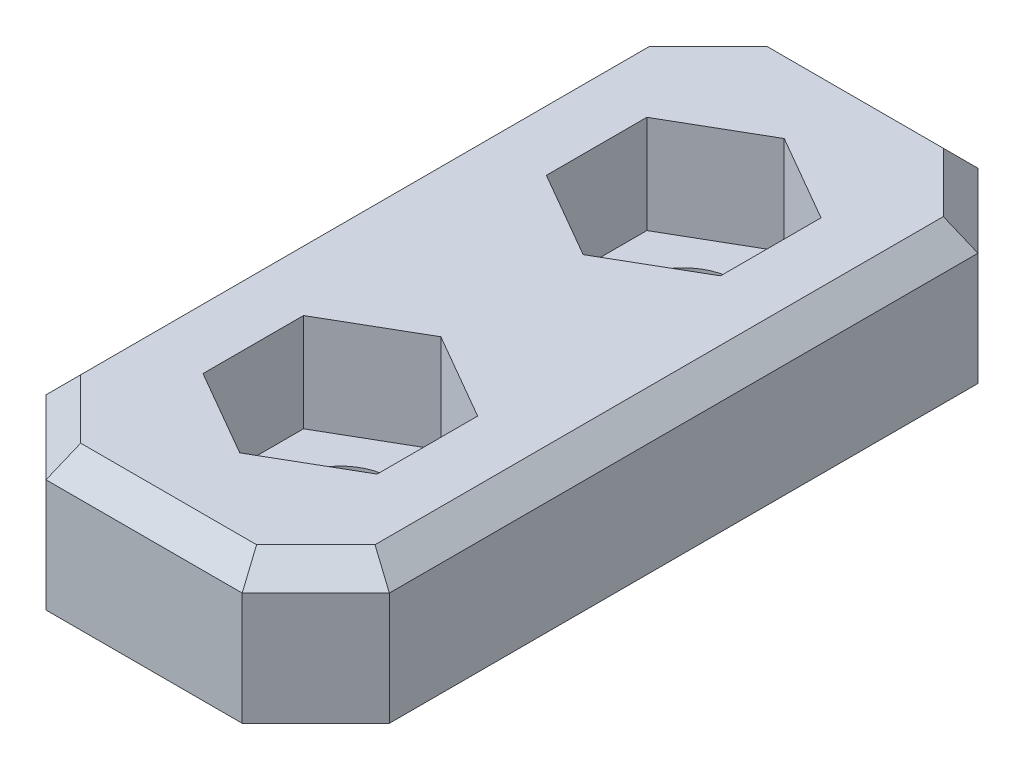
ISO-10303-21;
HEADER;
FILE_DESCRIPTION(('STEP AP214'),'2;1');
FILE_NAME('part.step','',(''),(''),'','','');
FILE_SCHEMA(('AUTOMOTIVE_DESIGN { 1 0 10303 214 1 1 1 1 }'));
ENDSEC;
DATA;
#1=APPLICATION_CONTEXT('core data for automotive mechanical design processes');
#2=APPLICATION_PROTOCOL_DEFINITION('international standard','automotive_design',2000,#1);
#3=PRODUCT_CONTEXT('',#1,'mechanical');
#4=PRODUCT('Part','Part','',(#3));
#5=PRODUCT_RELATED_PRODUCT_CATEGORY('part','',(#4));
#6=PRODUCT_DEFINITION_FORMATION('','',#4);
#7=PRODUCT_DEFINITION_CONTEXT('part definition',#1,'design');
#8=PRODUCT_DEFINITION('design','',#6,#7);
#9=PRODUCT_DEFINITION_SHAPE('','',#8);
#10=(LENGTH_UNIT() NAMED_UNIT(*) SI_UNIT(.MILLI.,.METRE.));
#11=(NAMED_UNIT(*) PLANE_ANGLE_UNIT() SI_UNIT($,.RADIAN.));
#12=(NAMED_UNIT(*) SI_UNIT($,.STERADIAN.) SOLID_ANGLE_UNIT());
#13=UNCERTAINTY_MEASURE_WITH_UNIT(LENGTH_MEASURE(1.E-05),#10,'distance_accuracy_value','');
#14=(GEOMETRIC_REPRESENTATION_CONTEXT(3) GLOBAL_UNCERTAINTY_ASSIGNED_CONTEXT((#13)) GLOBAL_UNIT_ASSIGNED_CONTEXT((#10,
#11,#12)) REPRESENTATION_CONTEXT('',''));
#15=CARTESIAN_POINT('',(0.,0.,0.));
#16=DIRECTION('',(0.,0.,1.));
#17=DIRECTION('',(1.,0.,0.));
#18=AXIS2_PLACEMENT_3D('',#15,#16,#17);
#19=CARTESIAN_POINT('',(7.,5.6,-22.));
#20=DIRECTION('',(0.,-1.,0.));
#21=DIRECTION('',(0.,0.,-1.));
#22=AXIS2_PLACEMENT_3D('',#19,#20,#21);
#23=CYLINDRICAL_SURFACE('',#22,2.1);
#24=CARTESIAN_POINT('',(7.,0.,-22.));
#25=DIRECTION('',(0.,1.,0.));
#26=DIRECTION('',(0.,0.,1.));
#27=AXIS2_PLACEMENT_3D('',#24,#25,#26);
#28=CIRCLE('',#27,2.1);
#29=CARTESIAN_POINT('',(7.,0.,-19.9));
#30=VERTEX_POINT('',#29);
#31=EDGE_CURVE('E308',#30,#30,#28,.T.);
#32=ORIENTED_EDGE('',*,*,#31,.F.);
#33=EDGE_LOOP('',(#32));
#34=FACE_BOUND('',#33,.T.);
#35=CARTESIAN_POINT('',(7.,1.6,-22.));
#36=DIRECTION('',(0.,1.,0.));
#37=DIRECTION('',(0.,0.,1.));
#38=AXIS2_PLACEMENT_3D('',#35,#36,#37);
#39=CIRCLE('',#38,2.1);
#40=CARTESIAN_POINT('',(7.,1.6,-19.9));
#41=VERTEX_POINT('',#40);
#42=EDGE_CURVE('E309',#41,#41,#39,.T.);
#43=ORIENTED_EDGE('',*,*,#42,.T.);
#44=EDGE_LOOP('',(#43));
#45=FACE_BOUND('',#44,.T.);
#46=ADVANCED_FACE('F34',(#34,#45),#23,.F.);
#47=CARTESIAN_POINT('',(7.,5.6,-8.));
#48=DIRECTION('',(0.,-1.,0.));
#49=DIRECTION('',(0.,0.,-1.));
#50=AXIS2_PLACEMENT_3D('',#47,#48,#49);
#51=CYLINDRICAL_SURFACE('',#50,2.1);
#52=CARTESIAN_POINT('',(7.,0.,-8.));
#53=DIRECTION('',(0.,1.,0.));
#54=DIRECTION('',(0.,0.,1.));
#55=AXIS2_PLACEMENT_3D('',#52,#53,#54);
#56=CIRCLE('',#55,2.1);
#57=CARTESIAN_POINT('',(7.,0.,-5.9));
#58=VERTEX_POINT('',#57);
#59=EDGE_CURVE('E305',#58,#58,#56,.T.);
#60=ORIENTED_EDGE('',*,*,#59,.F.);
#61=EDGE_LOOP('',(#60));
#62=FACE_BOUND('',#61,.T.);
#63=CARTESIAN_POINT('',(7.,1.6,-8.));
#64=DIRECTION('',(0.,1.,0.));
#65=DIRECTION('',(0.,0.,1.));
#66=AXIS2_PLACEMENT_3D('',#63,#64,#65);
#67=CIRCLE('',#66,2.1);
#68=CARTESIAN_POINT('',(7.,1.6,-5.9));
#69=VERTEX_POINT('',#68);
#70=EDGE_CURVE('E250',#69,#69,#67,.T.);
#71=ORIENTED_EDGE('',*,*,#70,.T.);
#72=EDGE_LOOP('',(#71));
#73=FACE_BOUND('',#72,.T.);
#74=ADVANCED_FACE('F479',(#62,#73),#51,.F.);
#75=CARTESIAN_POINT('',(0.,5.6,0.));
#76=DIRECTION('',(0.,-1.,0.));
#77=DIRECTION('',(0.,0.,-1.));
#78=AXIS2_PLACEMENT_3D('',#75,#76,#77);
#79=PLANE('',#78);
#80=DIRECTION('',(1.,0.,0.));
#81=VECTOR('',#80,1.);
#82=CARTESIAN_POINT('',(0.,5.6,-1.));
#83=LINE('',#82,#81);
#84=CARTESIAN_POINT('',(3.4142135623731,5.6,-1.));
#85=VERTEX_POINT('',#84);
#86=CARTESIAN_POINT('',(10.5857864376269,5.6,-1.00000000000001));
#87=VERTEX_POINT('',#86);
#88=EDGE_CURVE('E366',#85,#87,#83,.T.);
#89=ORIENTED_EDGE('',*,*,#88,.T.);
#90=DIRECTION('',(0.707106781186549,0.,-0.707106781186546));
#91=VECTOR('',#90,1.);
#92=CARTESIAN_POINT('',(13.2928932188135,5.6,-3.70710678118655));
#93=LINE('',#92,#91);
#94=CARTESIAN_POINT('',(13.,5.6,-3.4142135623731));
#95=VERTEX_POINT('',#94);
#96=EDGE_CURVE('E368',#87,#95,#93,.T.);
#97=ORIENTED_EDGE('',*,*,#96,.T.);
#98=DIRECTION('',(0.,0.,-1.));
#99=VECTOR('',#98,1.);
#100=CARTESIAN_POINT('',(13.,5.6,0.));
#101=LINE('',#100,#99);
#102=CARTESIAN_POINT('',(13.,5.6,-26.5857864376269));
#103=VERTEX_POINT('',#102);
#104=EDGE_CURVE('E354',#95,#103,#101,.T.);
#105=ORIENTED_EDGE('',*,*,#104,.T.);
#106=DIRECTION('',(-0.707106781186547,0.,-0.707106781186548));
#107=VECTOR('',#106,1.);
#108=CARTESIAN_POINT('',(10.2928932188134,5.6,-29.2928932188135));
#109=LINE('',#108,#107);
#110=CARTESIAN_POINT('',(10.5857864376269,5.6,-29.));
#111=VERTEX_POINT('',#110);
#112=EDGE_CURVE('E356',#103,#111,#109,.T.);
#113=ORIENTED_EDGE('',*,*,#112,.T.);
#114=DIRECTION('',(-1.,0.,0.));
#115=VECTOR('',#114,1.);
#116=CARTESIAN_POINT('',(0.,5.6,-29.));
#117=LINE('',#116,#115);
#118=CARTESIAN_POINT('',(3.41421356237311,5.6,-29.));
#119=VERTEX_POINT('',#118);
#120=EDGE_CURVE('E358',#111,#119,#117,.T.);
#121=ORIENTED_EDGE('',*,*,#120,.T.);
#122=DIRECTION('',(-0.707106781186549,0.,0.707106781186546));
#123=VECTOR('',#122,1.);
#124=CARTESIAN_POINT('',(0.707106781186549,5.6,-26.2928932188134));
#125=LINE('',#124,#123);
#126=CARTESIAN_POINT('',(1.,5.6,-26.5857864376269));
#127=VERTEX_POINT('',#126);
#128=EDGE_CURVE('E360',#119,#127,#125,.T.);
#129=ORIENTED_EDGE('',*,*,#128,.T.);
#130=DIRECTION('',(0.,0.,1.));
#131=VECTOR('',#130,1.);
#132=CARTESIAN_POINT('',(1.,5.6,0.));
#133=LINE('',#132,#131);
#134=CARTESIAN_POINT('',(1.,5.6,-3.41421356237311));
#135=VERTEX_POINT('',#134);
#136=EDGE_CURVE('E362',#127,#135,#133,.T.);
#137=ORIENTED_EDGE('',*,*,#136,.T.);
#138=DIRECTION('',(0.707106781186546,0.,0.707106781186549));
#139=VECTOR('',#138,1.);
#140=CARTESIAN_POINT('',(3.70710678118655,5.6,-0.70710678118655));
#141=LINE('',#140,#139);
#142=EDGE_CURVE('E364',#135,#85,#141,.T.);
#143=ORIENTED_EDGE('',*,*,#142,.T.);
#144=EDGE_LOOP('',(#89,#97,#105,#113,#121,#129,#137,#143));
#145=FACE_BOUND('',#144,.T.);
#146=DIRECTION('',(-0.866025403784439,0.,-0.5));
#147=VECTOR('',#146,1.);
#148=CARTESIAN_POINT('',(10.55,5.6,-24.0495934556232));
#149=LINE('',#148,#147);
#150=CARTESIAN_POINT('',(10.55,5.6,-24.0495934556232));
#151=VERTEX_POINT('',#150);
#152=CARTESIAN_POINT('',(7.,5.6,-26.0991869112463));
#153=VERTEX_POINT('',#152);
#154=EDGE_CURVE('E237',#151,#153,#149,.T.);
#155=ORIENTED_EDGE('',*,*,#154,.F.);
#156=DIRECTION('',(0.,0.,-1.));
#157=VECTOR('',#156,1.);
#158=CARTESIAN_POINT('',(10.55,5.6,-19.9504065443768));
#159=LINE('',#158,#157);
#160=CARTESIAN_POINT('',(10.55,5.6,-19.9504065443768));
#161=VERTEX_POINT('',#160);
#162=EDGE_CURVE('E205',#161,#151,#159,.T.);
#163=ORIENTED_EDGE('',*,*,#162,.F.);
#164=DIRECTION('',(0.866025403784439,0.,-0.5));
#165=VECTOR('',#164,1.);
#166=CARTESIAN_POINT('',(7.00000000000001,5.6,-17.9008130887537));
#167=LINE('',#166,#165);
#168=CARTESIAN_POINT('',(7.00000000000001,5.6,-17.9008130887537));
#169=VERTEX_POINT('',#168);
#170=EDGE_CURVE('E223',#169,#161,#167,.T.);
#171=ORIENTED_EDGE('',*,*,#170,.F.);
#172=DIRECTION('',(0.866025403784438,0.,0.5));
#173=VECTOR('',#172,1.);
#174=CARTESIAN_POINT('',(3.45000000000001,5.6,-19.9504065443768));
#175=LINE('',#174,#173);
#176=CARTESIAN_POINT('',(3.45000000000001,5.6,-19.9504065443768));
#177=VERTEX_POINT('',#176);
#178=EDGE_CURVE('E226',#177,#169,#175,.T.);
#179=ORIENTED_EDGE('',*,*,#178,.F.);
#180=DIRECTION('',(0.,0.,1.));
#181=VECTOR('',#180,1.);
#182=CARTESIAN_POINT('',(3.45000000000001,5.6,-24.0495934556232));
#183=LINE('',#182,#181);
#184=CARTESIAN_POINT('',(3.45000000000001,5.6,-24.0495934556232));
#185=VERTEX_POINT('',#184);
#186=EDGE_CURVE('E243',#185,#177,#183,.T.);
#187=ORIENTED_EDGE('',*,*,#186,.F.);
#188=DIRECTION('',(-0.866025403784438,0.,0.5));
#189=VECTOR('',#188,1.);
#190=CARTESIAN_POINT('',(7.,5.6,-26.0991869112463));
#191=LINE('',#190,#189);
#192=EDGE_CURVE('E240',#153,#185,#191,.T.);
#193=ORIENTED_EDGE('',*,*,#192,.F.);
#194=EDGE_LOOP('',(#155,#163,#171,#179,#187,#193));
#195=FACE_BOUND('',#194,.T.);
#196=DIRECTION('',(-0.866025403784439,0.,-0.5));
#197=VECTOR('',#196,1.);
#198=CARTESIAN_POINT('',(10.55,5.6,-10.0495934556232));
#199=LINE('',#198,#197);
#200=CARTESIAN_POINT('',(10.55,5.6,-10.0495934556232));
#201=VERTEX_POINT('',#200);
#202=CARTESIAN_POINT('',(7.,5.6,-12.0991869112463));
#203=VERTEX_POINT('',#202);
#204=EDGE_CURVE('E280',#201,#203,#199,.T.);
#205=ORIENTED_EDGE('',*,*,#204,.F.);
#206=DIRECTION('',(0.,0.,-1.));
#207=VECTOR('',#206,1.);
#208=CARTESIAN_POINT('',(10.55,5.6,-5.95040654437683));
#209=LINE('',#208,#207);
#210=CARTESIAN_POINT('',(10.55,5.6,-5.95040654437683));
#211=VERTEX_POINT('',#210);
#212=EDGE_CURVE('E278',#211,#201,#209,.T.);
#213=ORIENTED_EDGE('',*,*,#212,.F.);
#214=DIRECTION('',(0.866025403784439,0.,-0.5));
#215=VECTOR('',#214,1.);
#216=CARTESIAN_POINT('',(7.,5.6,-3.90081308875365));
#217=LINE('',#216,#215);
#218=CARTESIAN_POINT('',(7.,5.6,-3.90081308875365));
#219=VERTEX_POINT('',#218);
#220=EDGE_CURVE('E262',#219,#211,#217,.T.);
#221=ORIENTED_EDGE('',*,*,#220,.F.);
#222=DIRECTION('',(0.866025403784438,0.,0.5));
#223=VECTOR('',#222,1.);
#224=CARTESIAN_POINT('',(3.45,5.6,-5.95040654437683));
#225=LINE('',#224,#223);
#226=CARTESIAN_POINT('',(3.45,5.6,-5.95040654437683));
#227=VERTEX_POINT('',#226);
#228=EDGE_CURVE('E289',#227,#219,#225,.T.);
#229=ORIENTED_EDGE('',*,*,#228,.F.);
#230=DIRECTION('',(0.,0.,1.));
#231=VECTOR('',#230,1.);
#232=CARTESIAN_POINT('',(3.45,5.6,-10.0495934556232));
#233=LINE('',#232,#231);
#234=CARTESIAN_POINT('',(3.45,5.6,-10.0495934556232));
#235=VERTEX_POINT('',#234);
#236=EDGE_CURVE('E286',#235,#227,#233,.T.);
#237=ORIENTED_EDGE('',*,*,#236,.F.);
#238=DIRECTION('',(-0.866025403784439,0.,0.5));
#239=VECTOR('',#238,1.);
#240=CARTESIAN_POINT('',(7.,5.6,-12.0991869112463));
#241=LINE('',#240,#239);
#242=EDGE_CURVE('E283',#203,#235,#241,.T.);
#243=ORIENTED_EDGE('',*,*,#242,.F.);
#244=EDGE_LOOP('',(#205,#213,#221,#229,#237,#243));
#245=FACE_BOUND('',#244,.T.);
#246=ADVANCED_FACE('F447',(#145,#195,#245),#79,.F.);
#247=CARTESIAN_POINT('',(0.,0.,0.));
#248=DIRECTION('',(0.,-1.,0.));
#249=DIRECTION('',(0.,0.,-1.));
#250=AXIS2_PLACEMENT_3D('',#247,#248,#249);
#251=PLANE('',#250);
#252=ORIENTED_EDGE('',*,*,#31,.T.);
#253=EDGE_LOOP('',(#252));
#254=FACE_BOUND('',#253,.T.);
#255=DIRECTION('',(-1.,0.,0.));
#256=VECTOR('',#255,1.);
#257=CARTESIAN_POINT('',(0.,0.,-30.));
#258=LINE('',#257,#256);
#259=CARTESIAN_POINT('',(11.,0.,-30.));
#260=VERTEX_POINT('',#259);
#261=CARTESIAN_POINT('',(3.00000000000001,0.,-30.));
#262=VERTEX_POINT('',#261);
#263=EDGE_CURVE('E321',#260,#262,#258,.T.);
#264=ORIENTED_EDGE('',*,*,#263,.F.);
#265=DIRECTION('',(-0.707106781186547,0.,-0.707106781186548));
#266=VECTOR('',#265,1.);
#267=CARTESIAN_POINT('',(20.5,0.,-20.5));
#268=LINE('',#267,#266);
#269=CARTESIAN_POINT('',(14.,0.,-27.));
#270=VERTEX_POINT('',#269);
#271=EDGE_CURVE('E338',#260,#270,#268,.F.);
#272=ORIENTED_EDGE('',*,*,#271,.T.);
#273=DIRECTION('',(0.,0.,-1.));
#274=VECTOR('',#273,1.);
#275=CARTESIAN_POINT('',(14.,0.,0.));
#276=LINE('',#275,#274);
#277=CARTESIAN_POINT('',(14.,0.,-3.));
#278=VERTEX_POINT('',#277);
#279=EDGE_CURVE('E318',#278,#270,#276,.T.);
#280=ORIENTED_EDGE('',*,*,#279,.F.);
#281=DIRECTION('',(0.707106781186549,0.,-0.707106781186546));
#282=VECTOR('',#281,1.);
#283=CARTESIAN_POINT('',(5.49999999999998,0.,5.5));
#284=LINE('',#283,#282);
#285=CARTESIAN_POINT('',(11.,0.,0.));
#286=VERTEX_POINT('',#285);
#287=EDGE_CURVE('E332',#278,#286,#284,.F.);
#288=ORIENTED_EDGE('',*,*,#287,.T.);
#289=DIRECTION('',(1.,0.,0.));
#290=VECTOR('',#289,1.);
#291=CARTESIAN_POINT('',(0.,0.,0.));
#292=LINE('',#291,#290);
#293=CARTESIAN_POINT('',(3.,0.,0.));
#294=VERTEX_POINT('',#293);
#295=EDGE_CURVE('E315',#294,#286,#292,.T.);
#296=ORIENTED_EDGE('',*,*,#295,.F.);
#297=DIRECTION('',(0.707106781186546,0.,0.707106781186549));
#298=VECTOR('',#297,1.);
#299=CARTESIAN_POINT('',(1.50000000000001,0.,-1.5));
#300=LINE('',#299,#298);
#301=CARTESIAN_POINT('',(0.,0.,-3.00000000000001));
#302=VERTEX_POINT('',#301);
#303=EDGE_CURVE('E334',#294,#302,#300,.F.);
#304=ORIENTED_EDGE('',*,*,#303,.T.);
#305=DIRECTION('',(0.,0.,1.));
#306=VECTOR('',#305,1.);
#307=CARTESIAN_POINT('',(0.,0.,0.));
#308=LINE('',#307,#306);
#309=CARTESIAN_POINT('',(0.,0.,-27.));
#310=VERTEX_POINT('',#309);
#311=EDGE_CURVE('E312',#310,#302,#308,.T.);
#312=ORIENTED_EDGE('',*,*,#311,.F.);
#313=DIRECTION('',(-0.707106781186549,0.,0.707106781186546));
#314=VECTOR('',#313,1.);
#315=CARTESIAN_POINT('',(-13.5,0.,-13.5));
#316=LINE('',#315,#314);
#317=EDGE_CURVE('E336',#310,#262,#316,.F.);
#318=ORIENTED_EDGE('',*,*,#317,.T.);
#319=EDGE_LOOP('',(#264,#272,#280,#288,#296,#304,#312,#318));
#320=FACE_BOUND('',#319,.T.);
#321=ORIENTED_EDGE('',*,*,#59,.T.);
#322=EDGE_LOOP('',(#321));
#323=FACE_BOUND('',#322,.T.);
#324=ADVANCED_FACE('F423',(#254,#320,#323),#251,.T.);
#325=CARTESIAN_POINT('',(0.,5.6,0.));
#326=DIRECTION('',(1.,0.,0.));
#327=DIRECTION('',(0.,0.,-1.));
#328=AXIS2_PLACEMENT_3D('',#325,#326,#327);
#329=PLANE('',#328);
#330=DIRECTION('',(0.,1.,0.));
#331=VECTOR('',#330,1.);
#332=CARTESIAN_POINT('',(0.,5.6,-3.00000000000001));
#333=LINE('',#332,#331);
#334=CARTESIAN_POINT('',(0.,4.59999999999999,-3.00000000000001));
#335=VERTEX_POINT('',#334);
#336=EDGE_CURVE('E344',#302,#335,#333,.T.);
#337=ORIENTED_EDGE('',*,*,#336,.T.);
#338=DIRECTION('',(0.,0.,-1.));
#339=VECTOR('',#338,1.);
#340=CARTESIAN_POINT('',(0.,4.59999999999999,0.));
#341=LINE('',#340,#339);
#342=CARTESIAN_POINT('',(0.,4.59999999999999,-27.));
#343=VERTEX_POINT('',#342);
#344=EDGE_CURVE('E378',#335,#343,#341,.T.);
#345=ORIENTED_EDGE('',*,*,#344,.T.);
#346=DIRECTION('',(0.,-1.,0.));
#347=VECTOR('',#346,1.);
#348=CARTESIAN_POINT('',(0.,5.6,-27.));
#349=LINE('',#348,#347);
#350=EDGE_CURVE('E347',#343,#310,#349,.T.);
#351=ORIENTED_EDGE('',*,*,#350,.T.);
#352=ORIENTED_EDGE('',*,*,#311,.T.);
#353=EDGE_LOOP('',(#337,#345,#351,#352));
#354=FACE_BOUND('',#353,.T.);
#355=ADVANCED_FACE('F431',(#354),#329,.F.);
#356=CARTESIAN_POINT('',(0.,5.6,0.));
#357=DIRECTION('',(0.,0.,-1.));
#358=DIRECTION('',(-1.,0.,0.));
#359=AXIS2_PLACEMENT_3D('',#356,#357,#358);
#360=PLANE('',#359);
#361=DIRECTION('',(0.,1.,0.));
#362=VECTOR('',#361,1.);
#363=CARTESIAN_POINT('',(11.,5.6,0.));
#364=LINE('',#363,#362);
#365=CARTESIAN_POINT('',(11.,4.59999999999999,0.));
#366=VERTEX_POINT('',#365);
#367=EDGE_CURVE('E349',#286,#366,#364,.T.);
#368=ORIENTED_EDGE('',*,*,#367,.T.);
#369=DIRECTION('',(-1.,0.,0.));
#370=VECTOR('',#369,1.);
#371=CARTESIAN_POINT('',(0.,4.59999999999999,0.));
#372=LINE('',#371,#370);
#373=CARTESIAN_POINT('',(3.,4.59999999999999,0.));
#374=VERTEX_POINT('',#373);
#375=EDGE_CURVE('E374',#366,#374,#372,.T.);
#376=ORIENTED_EDGE('',*,*,#375,.T.);
#377=DIRECTION('',(0.,-1.,0.));
#378=VECTOR('',#377,1.);
#379=CARTESIAN_POINT('',(3.,5.6,0.));
#380=LINE('',#379,#378);
#381=EDGE_CURVE('E352',#374,#294,#380,.T.);
#382=ORIENTED_EDGE('',*,*,#381,.T.);
#383=ORIENTED_EDGE('',*,*,#295,.T.);
#384=EDGE_LOOP('',(#368,#376,#382,#383));
#385=FACE_BOUND('',#384,.T.);
#386=ADVANCED_FACE('F501',(#385),#360,.F.);
#387=CARTESIAN_POINT('',(14.,5.6,0.));
#388=DIRECTION('',(-1.,0.,0.));
#389=DIRECTION('',(0.,0.,1.));
#390=AXIS2_PLACEMENT_3D('',#387,#388,#389);
#391=PLANE('',#390);
#392=DIRECTION('',(0.,1.,0.));
#393=VECTOR('',#392,1.);
#394=CARTESIAN_POINT('',(14.,5.6,-27.));
#395=LINE('',#394,#393);
#396=CARTESIAN_POINT('',(14.,4.59999999999999,-27.));
#397=VERTEX_POINT('',#396);
#398=EDGE_CURVE('E342',#270,#397,#395,.T.);
#399=ORIENTED_EDGE('',*,*,#398,.T.);
#400=DIRECTION('',(0.,0.,1.));
#401=VECTOR('',#400,1.);
#402=CARTESIAN_POINT('',(14.,4.59999999999999,0.));
#403=LINE('',#402,#401);
#404=CARTESIAN_POINT('',(14.,4.59999999999999,-3.));
#405=VERTEX_POINT('',#404);
#406=EDGE_CURVE('E11',#397,#405,#403,.T.);
#407=ORIENTED_EDGE('',*,*,#406,.T.);
#408=DIRECTION('',(0.,-1.,0.));
#409=VECTOR('',#408,1.);
#410=CARTESIAN_POINT('',(14.,5.6,-3.));
#411=LINE('',#410,#409);
#412=EDGE_CURVE('E340',#405,#278,#411,.T.);
#413=ORIENTED_EDGE('',*,*,#412,.T.);
#414=ORIENTED_EDGE('',*,*,#279,.T.);
#415=EDGE_LOOP('',(#399,#407,#413,#414));
#416=FACE_BOUND('',#415,.T.);
#417=ADVANCED_FACE('F462',(#416),#391,.F.);
#418=CARTESIAN_POINT('',(0.,5.6,-30.));
#419=DIRECTION('',(0.,0.,1.));
#420=DIRECTION('',(1.,0.,0.));
#421=AXIS2_PLACEMENT_3D('',#418,#419,#420);
#422=PLANE('',#421);
#423=DIRECTION('',(0.,1.,0.));
#424=VECTOR('',#423,1.);
#425=CARTESIAN_POINT('',(3.00000000000001,5.6,-30.));
#426=LINE('',#425,#424);
#427=CARTESIAN_POINT('',(3.00000000000001,4.59999999999999,-30.));
#428=VERTEX_POINT('',#427);
#429=EDGE_CURVE('E324',#262,#428,#426,.T.);
#430=ORIENTED_EDGE('',*,*,#429,.T.);
#431=DIRECTION('',(1.,0.,0.));
#432=VECTOR('',#431,1.);
#433=CARTESIAN_POINT('',(0.,4.59999999999999,-30.));
#434=LINE('',#433,#432);
#435=CARTESIAN_POINT('',(11.,4.59999999999999,-30.));
#436=VERTEX_POINT('',#435);
#437=EDGE_CURVE('E59',#428,#436,#434,.T.);
#438=ORIENTED_EDGE('',*,*,#437,.T.);
#439=DIRECTION('',(0.,-1.,0.));
#440=VECTOR('',#439,1.);
#441=CARTESIAN_POINT('',(11.,5.6,-30.));
#442=LINE('',#441,#440);
#443=EDGE_CURVE('E330',#436,#260,#442,.T.);
#444=ORIENTED_EDGE('',*,*,#443,.T.);
#445=ORIENTED_EDGE('',*,*,#263,.T.);
#446=EDGE_LOOP('',(#430,#438,#444,#445));
#447=FACE_BOUND('',#446,.T.);
#448=ADVANCED_FACE('F419',(#447),#422,.F.);
#449=CARTESIAN_POINT('',(10.55,1.6,-5.95040654437683));
#450=DIRECTION('',(1.,0.,0.));
#451=DIRECTION('',(0.,0.,-1.));
#452=AXIS2_PLACEMENT_3D('',#449,#450,#451);
#453=PLANE('',#452);
#454=ORIENTED_EDGE('',*,*,#212,.T.);
#455=DIRECTION('',(0.,1.,0.));
#456=VECTOR('',#455,1.);
#457=CARTESIAN_POINT('',(10.55,1.6,-10.0495934556232));
#458=LINE('',#457,#456);
#459=CARTESIAN_POINT('',(10.55,1.6,-10.0495934556232));
#460=VERTEX_POINT('',#459);
#461=EDGE_CURVE('E277',#460,#201,#458,.T.);
#462=ORIENTED_EDGE('',*,*,#461,.F.);
#463=DIRECTION('',(0.,0.,-1.));
#464=VECTOR('',#463,1.);
#465=CARTESIAN_POINT('',(10.55,1.6,-5.95040654437683));
#466=LINE('',#465,#464);
#467=CARTESIAN_POINT('',(10.55,1.6,-5.95040654437683));
#468=VERTEX_POINT('',#467);
#469=EDGE_CURVE('E258',#468,#460,#466,.T.);
#470=ORIENTED_EDGE('',*,*,#469,.F.);
#471=DIRECTION('',(0.,1.,0.));
#472=VECTOR('',#471,1.);
#473=CARTESIAN_POINT('',(10.55,1.6,-5.95040654437683));
#474=LINE('',#473,#472);
#475=EDGE_CURVE('E238',#468,#211,#474,.T.);
#476=ORIENTED_EDGE('',*,*,#475,.T.);
#477=EDGE_LOOP('',(#454,#462,#470,#476));
#478=FACE_BOUND('',#477,.T.);
#479=ADVANCED_FACE('F498',(#478),#453,.F.);
#480=CARTESIAN_POINT('',(7.,1.6,-3.90081308875365));
#481=DIRECTION('',(0.5,0.,0.866025403784439));
#482=DIRECTION('',(0.866025403784439,0.,-0.5));
#483=AXIS2_PLACEMENT_3D('',#480,#481,#482);
#484=PLANE('',#483);
#485=ORIENTED_EDGE('',*,*,#220,.T.);
#486=ORIENTED_EDGE('',*,*,#475,.F.);
#487=DIRECTION('',(0.866025403784439,0.,-0.5));
#488=VECTOR('',#487,1.);
#489=CARTESIAN_POINT('',(7.,1.6,-3.90081308875365));
#490=LINE('',#489,#488);
#491=CARTESIAN_POINT('',(7.,1.6,-3.90081308875365));
#492=VERTEX_POINT('',#491);
#493=EDGE_CURVE('E274',#492,#468,#490,.T.);
#494=ORIENTED_EDGE('',*,*,#493,.F.);
#495=DIRECTION('',(0.,1.,0.));
#496=VECTOR('',#495,1.);
#497=CARTESIAN_POINT('',(7.,1.6,-3.90081308875365));
#498=LINE('',#497,#496);
#499=EDGE_CURVE('E295',#492,#219,#498,.T.);
#500=ORIENTED_EDGE('',*,*,#499,.T.);
#501=EDGE_LOOP('',(#485,#486,#494,#500));
#502=FACE_BOUND('',#501,.T.);
#503=ADVANCED_FACE('F724',(#502),#484,.F.);
#504=CARTESIAN_POINT('',(3.45,1.6,-5.95040654437683));
#505=DIRECTION('',(-0.5,0.,0.866025403784438));
#506=DIRECTION('',(0.866025403784439,0.,0.5));
#507=AXIS2_PLACEMENT_3D('',#504,#505,#506);
#508=PLANE('',#507);
#509=ORIENTED_EDGE('',*,*,#228,.T.);
#510=ORIENTED_EDGE('',*,*,#499,.F.);
#511=DIRECTION('',(0.866025403784438,0.,0.5));
#512=VECTOR('',#511,1.);
#513=CARTESIAN_POINT('',(3.45,1.6,-5.95040654437683));
#514=LINE('',#513,#512);
#515=CARTESIAN_POINT('',(3.45,1.6,-5.95040654437683));
#516=VERTEX_POINT('',#515);
#517=EDGE_CURVE('E271',#516,#492,#514,.T.);
#518=ORIENTED_EDGE('',*,*,#517,.F.);
#519=DIRECTION('',(0.,1.,0.));
#520=VECTOR('',#519,1.);
#521=CARTESIAN_POINT('',(3.45,1.6,-5.95040654437683));
#522=LINE('',#521,#520);
#523=EDGE_CURVE('E297',#516,#227,#522,.T.);
#524=ORIENTED_EDGE('',*,*,#523,.T.);
#525=EDGE_LOOP('',(#509,#510,#518,#524));
#526=FACE_BOUND('',#525,.T.);
#527=ADVANCED_FACE('F715',(#526),#508,.F.);
#528=CARTESIAN_POINT('',(3.45,1.6,-10.0495934556232));
#529=DIRECTION('',(-1.,0.,0.));
#530=DIRECTION('',(0.,0.,1.));
#531=AXIS2_PLACEMENT_3D('',#528,#529,#530);
#532=PLANE('',#531);
#533=ORIENTED_EDGE('',*,*,#236,.T.);
#534=ORIENTED_EDGE('',*,*,#523,.F.);
#535=DIRECTION('',(0.,0.,1.));
#536=VECTOR('',#535,1.);
#537=CARTESIAN_POINT('',(3.45,1.6,-10.0495934556232));
#538=LINE('',#537,#536);
#539=CARTESIAN_POINT('',(3.45,1.6,-10.0495934556232));
#540=VERTEX_POINT('',#539);
#541=EDGE_CURVE('E268',#540,#516,#538,.T.);
#542=ORIENTED_EDGE('',*,*,#541,.F.);
#543=DIRECTION('',(0.,1.,0.));
#544=VECTOR('',#543,1.);
#545=CARTESIAN_POINT('',(3.45,1.6,-10.0495934556232));
#546=LINE('',#545,#544);
#547=EDGE_CURVE('E299',#540,#235,#546,.T.);
#548=ORIENTED_EDGE('',*,*,#547,.T.);
#549=EDGE_LOOP('',(#533,#534,#542,#548));
#550=FACE_BOUND('',#549,.T.);
#551=ADVANCED_FACE('F706',(#550),#532,.F.);
#552=CARTESIAN_POINT('',(7.,1.6,-12.0991869112463));
#553=DIRECTION('',(-0.5,0.,-0.866025403784439));
#554=DIRECTION('',(-0.866025403784439,0.,0.5));
#555=AXIS2_PLACEMENT_3D('',#552,#553,#554);
#556=PLANE('',#555);
#557=ORIENTED_EDGE('',*,*,#242,.T.);
#558=ORIENTED_EDGE('',*,*,#547,.F.);
#559=DIRECTION('',(-0.866025403784439,0.,0.5));
#560=VECTOR('',#559,1.);
#561=CARTESIAN_POINT('',(7.,1.6,-12.0991869112463));
#562=LINE('',#561,#560);
#563=CARTESIAN_POINT('',(7.,1.6,-12.0991869112463));
#564=VERTEX_POINT('',#563);
#565=EDGE_CURVE('E265',#564,#540,#562,.T.);
#566=ORIENTED_EDGE('',*,*,#565,.F.);
#567=DIRECTION('',(0.,1.,0.));
#568=VECTOR('',#567,1.);
#569=CARTESIAN_POINT('',(7.,1.6,-12.0991869112463));
#570=LINE('',#569,#568);
#571=EDGE_CURVE('E301',#564,#203,#570,.T.);
#572=ORIENTED_EDGE('',*,*,#571,.T.);
#573=EDGE_LOOP('',(#557,#558,#566,#572));
#574=FACE_BOUND('',#573,.T.);
#575=ADVANCED_FACE('F697',(#574),#556,.F.);
#576=CARTESIAN_POINT('',(10.55,1.6,-10.0495934556232));
#577=DIRECTION('',(0.5,0.,-0.866025403784439));
#578=DIRECTION('',(-0.866025403784439,0.,-0.5));
#579=AXIS2_PLACEMENT_3D('',#576,#577,#578);
#580=PLANE('',#579);
#581=ORIENTED_EDGE('',*,*,#204,.T.);
#582=ORIENTED_EDGE('',*,*,#571,.F.);
#583=DIRECTION('',(-0.866025403784439,0.,-0.5));
#584=VECTOR('',#583,1.);
#585=CARTESIAN_POINT('',(10.55,1.6,-10.0495934556232));
#586=LINE('',#585,#584);
#587=EDGE_CURVE('E261',#460,#564,#586,.T.);
#588=ORIENTED_EDGE('',*,*,#587,.F.);
#589=ORIENTED_EDGE('',*,*,#461,.T.);
#590=EDGE_LOOP('',(#581,#582,#588,#589));
#591=FACE_BOUND('',#590,.T.);
#592=ADVANCED_FACE('F688',(#591),#580,.F.);
#593=CARTESIAN_POINT('',(0.,1.6,0.));
#594=DIRECTION('',(0.,1.,0.));
#595=DIRECTION('',(0.,0.,1.));
#596=AXIS2_PLACEMENT_3D('',#593,#594,#595);
#597=PLANE('',#596);
#598=ORIENTED_EDGE('',*,*,#70,.F.);
#599=EDGE_LOOP('',(#598));
#600=FACE_BOUND('',#599,.T.);
#601=ORIENTED_EDGE('',*,*,#469,.T.);
#602=ORIENTED_EDGE('',*,*,#587,.T.);
#603=ORIENTED_EDGE('',*,*,#565,.T.);
#604=ORIENTED_EDGE('',*,*,#541,.T.);
#605=ORIENTED_EDGE('',*,*,#517,.T.);
#606=ORIENTED_EDGE('',*,*,#493,.T.);
#607=EDGE_LOOP('',(#601,#602,#603,#604,#605,#606));
#608=FACE_BOUND('',#607,.T.);
#609=ADVANCED_FACE('F680',(#600,#608),#597,.T.);
#610=CARTESIAN_POINT('',(10.55,1.6,-19.9504065443768));
#611=DIRECTION('',(1.,0.,0.));
#612=DIRECTION('',(0.,0.,-1.));
#613=AXIS2_PLACEMENT_3D('',#610,#611,#612);
#614=PLANE('',#613);
#615=ORIENTED_EDGE('',*,*,#162,.T.);
#616=DIRECTION('',(0.,1.,0.));
#617=VECTOR('',#616,1.);
#618=CARTESIAN_POINT('',(10.55,1.6,-24.0495934556232));
#619=LINE('',#618,#617);
#620=CARTESIAN_POINT('',(10.55,1.6,-24.0495934556232));
#621=VERTEX_POINT('',#620);
#622=EDGE_CURVE('E198',#621,#151,#619,.T.);
#623=ORIENTED_EDGE('',*,*,#622,.F.);
#624=DIRECTION('',(0.,0.,-1.));
#625=VECTOR('',#624,1.);
#626=CARTESIAN_POINT('',(10.55,1.6,-19.9504065443768));
#627=LINE('',#626,#625);
#628=CARTESIAN_POINT('',(10.55,1.6,-19.9504065443768));
#629=VERTEX_POINT('',#628);
#630=EDGE_CURVE('E202',#629,#621,#627,.T.);
#631=ORIENTED_EDGE('',*,*,#630,.F.);
#632=DIRECTION('',(0.,1.,0.));
#633=VECTOR('',#632,1.);
#634=CARTESIAN_POINT('',(10.55,1.6,-19.9504065443768));
#635=LINE('',#634,#633);
#636=EDGE_CURVE('E248',#629,#161,#635,.T.);
#637=ORIENTED_EDGE('',*,*,#636,.T.);
#638=EDGE_LOOP('',(#615,#623,#631,#637));
#639=FACE_BOUND('',#638,.T.);
#640=ADVANCED_FACE('F200',(#639),#614,.F.);
#641=CARTESIAN_POINT('',(7.00000000000001,1.6,-17.9008130887537));
#642=DIRECTION('',(0.5,0.,0.866025403784439));
#643=DIRECTION('',(0.866025403784439,0.,-0.5));
#644=AXIS2_PLACEMENT_3D('',#641,#642,#643);
#645=PLANE('',#644);
#646=ORIENTED_EDGE('',*,*,#170,.T.);
#647=ORIENTED_EDGE('',*,*,#636,.F.);
#648=DIRECTION('',(0.866025403784439,0.,-0.5));
#649=VECTOR('',#648,1.);
#650=CARTESIAN_POINT('',(7.00000000000001,1.6,-17.9008130887537));
#651=LINE('',#650,#649);
#652=CARTESIAN_POINT('',(7.00000000000001,1.6,-17.9008130887537));
#653=VERTEX_POINT('',#652);
#654=EDGE_CURVE('E210',#653,#629,#651,.T.);
#655=ORIENTED_EDGE('',*,*,#654,.F.);
#656=DIRECTION('',(0.,1.,0.));
#657=VECTOR('',#656,1.);
#658=CARTESIAN_POINT('',(7.00000000000001,1.6,-17.9008130887537));
#659=LINE('',#658,#657);
#660=EDGE_CURVE('E251',#653,#169,#659,.T.);
#661=ORIENTED_EDGE('',*,*,#660,.T.);
#662=EDGE_LOOP('',(#646,#647,#655,#661));
#663=FACE_BOUND('',#662,.T.);
#664=ADVANCED_FACE('F663',(#663),#645,.F.);
#665=CARTESIAN_POINT('',(3.45000000000001,1.6,-19.9504065443768));
#666=DIRECTION('',(-0.5,0.,0.866025403784438));
#667=DIRECTION('',(0.866025403784438,0.,0.5));
#668=AXIS2_PLACEMENT_3D('',#665,#666,#667);
#669=PLANE('',#668);
#670=ORIENTED_EDGE('',*,*,#178,.T.);
#671=ORIENTED_EDGE('',*,*,#660,.F.);
#672=DIRECTION('',(0.866025403784438,0.,0.5));
#673=VECTOR('',#672,1.);
#674=CARTESIAN_POINT('',(3.45000000000001,1.6,-19.9504065443768));
#675=LINE('',#674,#673);
#676=CARTESIAN_POINT('',(3.45000000000001,1.6,-19.9504065443768));
#677=VERTEX_POINT('',#676);
#678=EDGE_CURVE('E233',#677,#653,#675,.T.);
#679=ORIENTED_EDGE('',*,*,#678,.F.);
#680=DIRECTION('',(0.,1.,0.));
#681=VECTOR('',#680,1.);
#682=CARTESIAN_POINT('',(3.45000000000001,1.6,-19.9504065443768));
#683=LINE('',#682,#681);
#684=EDGE_CURVE('E253',#677,#177,#683,.T.);
#685=ORIENTED_EDGE('',*,*,#684,.T.);
#686=EDGE_LOOP('',(#670,#671,#679,#685));
#687=FACE_BOUND('',#686,.T.);
#688=ADVANCED_FACE('F654',(#687),#669,.F.);
#689=CARTESIAN_POINT('',(3.45000000000001,1.6,-24.0495934556232));
#690=DIRECTION('',(-1.,0.,0.));
#691=DIRECTION('',(0.,0.,1.));
#692=AXIS2_PLACEMENT_3D('',#689,#690,#691);
#693=PLANE('',#692);
#694=ORIENTED_EDGE('',*,*,#186,.T.);
#695=ORIENTED_EDGE('',*,*,#684,.F.);
#696=DIRECTION('',(0.,0.,1.));
#697=VECTOR('',#696,1.);
#698=CARTESIAN_POINT('',(3.45000000000001,1.6,-24.0495934556232));
#699=LINE('',#698,#697);
#700=CARTESIAN_POINT('',(3.45000000000001,1.6,-24.0495934556232));
#701=VERTEX_POINT('',#700);
#702=EDGE_CURVE('E230',#701,#677,#699,.T.);
#703=ORIENTED_EDGE('',*,*,#702,.F.);
#704=DIRECTION('',(0.,1.,0.));
#705=VECTOR('',#704,1.);
#706=CARTESIAN_POINT('',(3.45000000000001,1.6,-24.0495934556232));
#707=LINE('',#706,#705);
#708=EDGE_CURVE('E255',#701,#185,#707,.T.);
#709=ORIENTED_EDGE('',*,*,#708,.T.);
#710=EDGE_LOOP('',(#694,#695,#703,#709));
#711=FACE_BOUND('',#710,.T.);
#712=ADVANCED_FACE('F645',(#711),#693,.F.);
#713=CARTESIAN_POINT('',(7.,1.6,-26.0991869112463));
#714=DIRECTION('',(-0.5,0.,-0.866025403784439));
#715=DIRECTION('',(-0.866025403784438,0.,0.5));
#716=AXIS2_PLACEMENT_3D('',#713,#714,#715);
#717=PLANE('',#716);
#718=ORIENTED_EDGE('',*,*,#192,.T.);
#719=ORIENTED_EDGE('',*,*,#708,.F.);
#720=DIRECTION('',(-0.866025403784438,0.,0.5));
#721=VECTOR('',#720,1.);
#722=CARTESIAN_POINT('',(7.,1.6,-26.0991869112463));
#723=LINE('',#722,#721);
#724=CARTESIAN_POINT('',(7.,1.6,-26.0991869112463));
#725=VERTEX_POINT('',#724);
#726=EDGE_CURVE('E218',#725,#701,#723,.T.);
#727=ORIENTED_EDGE('',*,*,#726,.F.);
#728=DIRECTION('',(0.,1.,0.));
#729=VECTOR('',#728,1.);
#730=CARTESIAN_POINT('',(7.,1.6,-26.0991869112463));
#731=LINE('',#730,#729);
#732=EDGE_CURVE('E209',#725,#153,#731,.T.);
#733=ORIENTED_EDGE('',*,*,#732,.T.);
#734=EDGE_LOOP('',(#718,#719,#727,#733));
#735=FACE_BOUND('',#734,.T.);
#736=ADVANCED_FACE('F637',(#735),#717,.F.);
#737=CARTESIAN_POINT('',(10.55,1.6,-24.0495934556232));
#738=DIRECTION('',(0.5,0.,-0.866025403784439));
#739=DIRECTION('',(-0.866025403784439,0.,-0.5));
#740=AXIS2_PLACEMENT_3D('',#737,#738,#739);
#741=PLANE('',#740);
#742=ORIENTED_EDGE('',*,*,#154,.T.);
#743=ORIENTED_EDGE('',*,*,#732,.F.);
#744=DIRECTION('',(-0.866025403784439,0.,-0.5));
#745=VECTOR('',#744,1.);
#746=CARTESIAN_POINT('',(10.55,1.6,-24.0495934556232));
#747=LINE('',#746,#745);
#748=EDGE_CURVE('E213',#621,#725,#747,.T.);
#749=ORIENTED_EDGE('',*,*,#748,.F.);
#750=ORIENTED_EDGE('',*,*,#622,.T.);
#751=EDGE_LOOP('',(#742,#743,#749,#750));
#752=FACE_BOUND('',#751,.T.);
#753=ADVANCED_FACE('F214',(#752),#741,.F.);
#754=CARTESIAN_POINT('',(0.,1.6,0.));
#755=DIRECTION('',(0.,1.,0.));
#756=DIRECTION('',(0.,0.,1.));
#757=AXIS2_PLACEMENT_3D('',#754,#755,#756);
#758=PLANE('',#757);
#759=ORIENTED_EDGE('',*,*,#42,.F.);
#760=EDGE_LOOP('',(#759));
#761=FACE_BOUND('',#760,.T.);
#762=ORIENTED_EDGE('',*,*,#630,.T.);
#763=ORIENTED_EDGE('',*,*,#748,.T.);
#764=ORIENTED_EDGE('',*,*,#726,.T.);
#765=ORIENTED_EDGE('',*,*,#702,.T.);
#766=ORIENTED_EDGE('',*,*,#678,.T.);
#767=ORIENTED_EDGE('',*,*,#654,.T.);
#768=EDGE_LOOP('',(#762,#763,#764,#765,#766,#767));
#769=FACE_BOUND('',#768,.T.);
#770=ADVANCED_FACE('F220',(#761,#769),#758,.T.);
#771=CARTESIAN_POINT('',(11.,5.6,-30.));
#772=DIRECTION('',(-0.707106781186548,0.,0.707106781186547));
#773=DIRECTION('',(0.,-1.,0.));
#774=AXIS2_PLACEMENT_3D('',#771,#772,#773);
#775=PLANE('',#774);
#776=ORIENTED_EDGE('',*,*,#443,.F.);
#777=DIRECTION('',(-0.707106781186547,0.,-0.707106781186548));
#778=VECTOR('',#777,1.);
#779=CARTESIAN_POINT('',(14.,4.59999999999999,-27.));
#780=LINE('',#779,#778);
#781=EDGE_CURVE('E44',#436,#397,#780,.F.);
#782=ORIENTED_EDGE('',*,*,#781,.T.);
#783=ORIENTED_EDGE('',*,*,#398,.F.);
#784=ORIENTED_EDGE('',*,*,#271,.F.);
#785=EDGE_LOOP('',(#776,#782,#783,#784));
#786=FACE_BOUND('',#785,.T.);
#787=ADVANCED_FACE('F508',(#786),#775,.F.);
#788=CARTESIAN_POINT('',(0.,5.6,-27.));
#789=DIRECTION('',(0.707106781186546,0.,0.707106781186549));
#790=DIRECTION('',(0.,-1.,0.));
#791=AXIS2_PLACEMENT_3D('',#788,#789,#790);
#792=PLANE('',#791);
#793=ORIENTED_EDGE('',*,*,#350,.F.);
#794=DIRECTION('',(-0.707106781186549,0.,0.707106781186546));
#795=VECTOR('',#794,1.);
#796=CARTESIAN_POINT('',(3.00000000000001,4.59999999999999,-30.));
#797=LINE('',#796,#795);
#798=EDGE_CURVE('E380',#343,#428,#797,.F.);
#799=ORIENTED_EDGE('',*,*,#798,.T.);
#800=ORIENTED_EDGE('',*,*,#429,.F.);
#801=ORIENTED_EDGE('',*,*,#317,.F.);
#802=EDGE_LOOP('',(#793,#799,#800,#801));
#803=FACE_BOUND('',#802,.T.);
#804=ADVANCED_FACE('F417',(#803),#792,.F.);
#805=CARTESIAN_POINT('',(3.,5.6,0.));
#806=DIRECTION('',(0.707106781186549,0.,-0.707106781186546));
#807=DIRECTION('',(0.,-1.,0.));
#808=AXIS2_PLACEMENT_3D('',#805,#806,#807);
#809=PLANE('',#808);
#810=ORIENTED_EDGE('',*,*,#381,.F.);
#811=DIRECTION('',(0.707106781186546,0.,0.707106781186549));
#812=VECTOR('',#811,1.);
#813=CARTESIAN_POINT('',(0.,4.59999999999999,-3.00000000000001));
#814=LINE('',#813,#812);
#815=EDGE_CURVE('E376',#374,#335,#814,.F.);
#816=ORIENTED_EDGE('',*,*,#815,.T.);
#817=ORIENTED_EDGE('',*,*,#336,.F.);
#818=ORIENTED_EDGE('',*,*,#303,.F.);
#819=EDGE_LOOP('',(#810,#816,#817,#818));
#820=FACE_BOUND('',#819,.T.);
#821=ADVANCED_FACE('F434',(#820),#809,.F.);
#822=CARTESIAN_POINT('',(14.,5.6,-3.));
#823=DIRECTION('',(-0.707106781186546,0.,-0.707106781186549));
#824=DIRECTION('',(0.,-1.,0.));
#825=AXIS2_PLACEMENT_3D('',#822,#823,#824);
#826=PLANE('',#825);
#827=ORIENTED_EDGE('',*,*,#412,.F.);
#828=DIRECTION('',(0.707106781186549,0.,-0.707106781186546));
#829=VECTOR('',#828,1.);
#830=CARTESIAN_POINT('',(11.,4.59999999999999,0.));
#831=LINE('',#830,#829);
#832=EDGE_CURVE('E371',#405,#366,#831,.F.);
#833=ORIENTED_EDGE('',*,*,#832,.T.);
#834=ORIENTED_EDGE('',*,*,#367,.F.);
#835=ORIENTED_EDGE('',*,*,#287,.F.);
#836=EDGE_LOOP('',(#827,#833,#834,#835));
#837=FACE_BOUND('',#836,.T.);
#838=ADVANCED_FACE('F466',(#837),#826,.F.);
#839=CARTESIAN_POINT('',(-12.7928932188135,5.6,-12.7928932188135));
#840=DIRECTION('',(0.5,-0.707106781186546,0.500000000000002));
#841=DIRECTION('',(-0.707106781186549,0.,0.707106781186546));
#842=AXIS2_PLACEMENT_3D('',#839,#840,#841);
#843=PLANE('',#842);
#844=DIRECTION('',(0.28108463771482,0.678598344545849,0.678598344545845));
#845=VECTOR('',#844,1.);
#846=CARTESIAN_POINT('',(3.14446141898329,4.94876071694908,-29.6512392830509));
#847=LINE('',#846,#845);
#848=EDGE_CURVE('E399',#428,#119,#847,.T.);
#849=ORIENTED_EDGE('',*,*,#848,.F.);
#850=ORIENTED_EDGE('',*,*,#798,.F.);
#851=DIRECTION('',(0.678598344545846,0.678598344545849,0.281084637714819));
#852=VECTOR('',#851,1.);
#853=CARTESIAN_POINT('',(-2.72066250932182,1.87933749067816,-28.1269353100011));
#854=LINE('',#853,#852);
#855=EDGE_CURVE('E39',#127,#343,#854,.F.);
#856=ORIENTED_EDGE('',*,*,#855,.F.);
#857=ORIENTED_EDGE('',*,*,#128,.F.);
#858=EDGE_LOOP('',(#849,#850,#856,#857));
#859=FACE_BOUND('',#858,.T.);
#860=ADVANCED_FACE('F37',(#859),#843,.F.);
#861=CARTESIAN_POINT('',(1.,5.6,0.));
#862=DIRECTION('',(0.707106781186549,-0.707106781186546,0.));
#863=DIRECTION('',(0.,0.,1.));
#864=AXIS2_PLACEMENT_3D('',#861,#862,#863);
#865=PLANE('',#864);
#866=ORIENTED_EDGE('',*,*,#855,.T.);
#867=ORIENTED_EDGE('',*,*,#344,.F.);
#868=DIRECTION('',(0.678598344545846,0.678598344545848,-0.28108463771482));
#869=VECTOR('',#868,1.);
#870=CARTESIAN_POINT('',(0.348760716949095,4.94876071694909,-3.14446141898329));
#871=LINE('',#870,#869);
#872=EDGE_CURVE('E397',#135,#335,#871,.F.);
#873=ORIENTED_EDGE('',*,*,#872,.F.);
#874=ORIENTED_EDGE('',*,*,#136,.F.);
#875=EDGE_LOOP('',(#866,#867,#873,#874));
#876=FACE_BOUND('',#875,.T.);
#877=ADVANCED_FACE('F409',(#876),#865,.F.);
#878=CARTESIAN_POINT('',(0.,5.6,-29.));
#879=DIRECTION('',(0.,-0.707106781186545,0.70710678118655));
#880=DIRECTION('',(-1.,0.,0.));
#881=AXIS2_PLACEMENT_3D('',#878,#879,#880);
#882=PLANE('',#881);
#883=ORIENTED_EDGE('',*,*,#848,.T.);
#884=ORIENTED_EDGE('',*,*,#120,.F.);
#885=DIRECTION('',(-0.281084637714821,0.678598344545849,0.678598344545845));
#886=VECTOR('',#885,1.);
#887=CARTESIAN_POINT('',(9.55703039576179,8.083636788644,-26.516363211356));
#888=LINE('',#887,#886);
#889=EDGE_CURVE('E394',#436,#111,#888,.T.);
#890=ORIENTED_EDGE('',*,*,#889,.F.);
#891=ORIENTED_EDGE('',*,*,#437,.F.);
#892=EDGE_LOOP('',(#883,#884,#890,#891));
#893=FACE_BOUND('',#892,.T.);
#894=ADVANCED_FACE('F451',(#893),#882,.F.);
#895=CARTESIAN_POINT('',(2.20710678118656,5.6,-2.20710678118655));
#896=DIRECTION('',(0.500000000000002,-0.707106781186546,-0.5));
#897=DIRECTION('',(0.707106781186546,0.,0.707106781186549));
#898=AXIS2_PLACEMENT_3D('',#895,#896,#897);
#899=PLANE('',#898);
#900=ORIENTED_EDGE('',*,*,#872,.T.);
#901=ORIENTED_EDGE('',*,*,#815,.F.);
#902=DIRECTION('',(0.281084637714821,0.678598344545848,-0.678598344545846));
#903=VECTOR('',#902,1.);
#904=CARTESIAN_POINT('',(3.54908963406801,5.92561964152545,-1.32561964152546));
#905=LINE('',#904,#903);
#906=EDGE_CURVE('E391',#85,#374,#905,.F.);
#907=ORIENTED_EDGE('',*,*,#906,.F.);
#908=ORIENTED_EDGE('',*,*,#142,.F.);
#909=EDGE_LOOP('',(#900,#901,#907,#908));
#910=FACE_BOUND('',#909,.T.);
#911=ADVANCED_FACE('F438',(#910),#899,.F.);
#912=CARTESIAN_POINT('',(19.7928932188135,5.6,-19.7928932188134));
#913=DIRECTION('',(-0.500000000000002,-0.707106781186546,0.500000000000001));
#914=DIRECTION('',(-0.707106781186547,0.,-0.707106781186548));
#915=AXIS2_PLACEMENT_3D('',#912,#913,#914);
#916=PLANE('',#915);
#917=ORIENTED_EDGE('',*,*,#889,.T.);
#918=ORIENTED_EDGE('',*,*,#112,.F.);
#919=DIRECTION('',(-0.678598344545846,0.678598344545849,0.281084637714818));
#920=VECTOR('',#919,1.);
#921=CARTESIAN_POINT('',(7.92893218813458,10.6710678118654,-24.4852813742386));
#922=LINE('',#921,#920);
#923=EDGE_CURVE('E388',#397,#103,#922,.T.);
#924=ORIENTED_EDGE('',*,*,#923,.F.);
#925=ORIENTED_EDGE('',*,*,#781,.F.);
#926=EDGE_LOOP('',(#917,#918,#924,#925));
#927=FACE_BOUND('',#926,.T.);
#928=ADVANCED_FACE('F453',(#927),#916,.F.);
#929=CARTESIAN_POINT('',(0.,5.6,-1.));
#930=DIRECTION('',(0.,-0.707106781186546,-0.707106781186549));
#931=DIRECTION('',(1.,0.,0.));
#932=AXIS2_PLACEMENT_3D('',#929,#930,#931);
#933=PLANE('',#932);
#934=ORIENTED_EDGE('',*,*,#906,.T.);
#935=ORIENTED_EDGE('',*,*,#375,.F.);
#936=DIRECTION('',(-0.28108463771482,0.678598344545848,-0.678598344545846));
#937=VECTOR('',#936,1.);
#938=CARTESIAN_POINT('',(9.74941855118692,7.61917069457674,-3.01917069457674));
#939=LINE('',#938,#937);
#940=EDGE_CURVE('E386',#87,#366,#939,.F.);
#941=ORIENTED_EDGE('',*,*,#940,.F.);
#942=ORIENTED_EDGE('',*,*,#88,.F.);
#943=EDGE_LOOP('',(#934,#935,#941,#942));
#944=FACE_BOUND('',#943,.T.);
#945=ADVANCED_FACE('F443',(#944),#933,.F.);
#946=CARTESIAN_POINT('',(13.,5.6,0.));
#947=DIRECTION('',(-0.707106781186549,-0.707106781186546,0.));
#948=DIRECTION('',(0.,0.,-1.));
#949=AXIS2_PLACEMENT_3D('',#946,#947,#948);
#950=PLANE('',#949);
#951=ORIENTED_EDGE('',*,*,#923,.T.);
#952=ORIENTED_EDGE('',*,*,#104,.F.);
#953=DIRECTION('',(0.678598344545846,-0.678598344545848,0.281084637714821));
#954=VECTOR('',#953,1.);
#955=CARTESIAN_POINT('',(13.6512392830509,4.94876071694909,-3.14446141898328));
#956=LINE('',#955,#954);
#957=EDGE_CURVE('E384',#405,#95,#956,.F.);
#958=ORIENTED_EDGE('',*,*,#957,.F.);
#959=ORIENTED_EDGE('',*,*,#406,.F.);
#960=EDGE_LOOP('',(#951,#952,#958,#959));
#961=FACE_BOUND('',#960,.T.);
#962=ADVANCED_FACE('F459',(#961),#950,.F.);
#963=CARTESIAN_POINT('',(4.79289321881343,5.6,4.79289321881345));
#964=DIRECTION('',(-0.5,-0.707106781186547,-0.500000000000002));
#965=DIRECTION('',(0.707106781186549,0.,-0.707106781186546));
#966=AXIS2_PLACEMENT_3D('',#963,#964,#965);
#967=PLANE('',#966);
#968=ORIENTED_EDGE('',*,*,#940,.T.);
#969=ORIENTED_EDGE('',*,*,#832,.F.);
#970=ORIENTED_EDGE('',*,*,#957,.T.);
#971=ORIENTED_EDGE('',*,*,#96,.F.);
#972=EDGE_LOOP('',(#968,#969,#970,#971));
#973=FACE_BOUND('',#972,.T.);
#974=ADVANCED_FACE('F469',(#973),#967,.F.);
#975=CLOSED_SHELL('',(#46,#74,#246,#324,#355,#386,#417,#448,#479,#503,#527,#551,#575,#592,#609,
#640,#664,#688,#712,#736,#753,#770,#787,#804,#821,#838,#860,#877,#894,#911,#928,#945,#962,#974));
#976=MANIFOLD_SOLID_BREP('B2',#975);
#977=ADVANCED_BREP_SHAPE_REPRESENTATION('',(#18,#976),#14);
#978=SHAPE_DEFINITION_REPRESENTATION(#9,#977);
ENDSEC;
END-ISO-10303-21;
